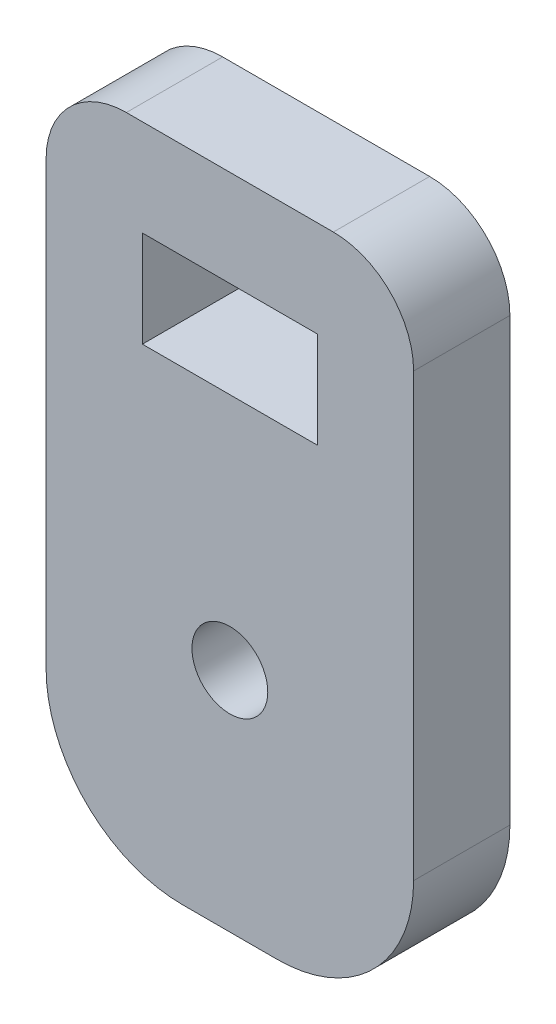
ISO-10303-21;
HEADER;
FILE_DESCRIPTION(('STEP AP214'),'2;1');
FILE_NAME('part.step','',(''),(''),'','','');
FILE_SCHEMA(('AUTOMOTIVE_DESIGN { 1 0 10303 214 1 1 1 1 }'));
ENDSEC;
DATA;
#1=APPLICATION_CONTEXT('core data for automotive mechanical design processes');
#2=APPLICATION_PROTOCOL_DEFINITION('international standard','automotive_design',2000,#1);
#3=PRODUCT_CONTEXT('',#1,'mechanical');
#4=PRODUCT('Part','Part','',(#3));
#5=PRODUCT_RELATED_PRODUCT_CATEGORY('part','',(#4));
#6=PRODUCT_DEFINITION_FORMATION('','',#4);
#7=PRODUCT_DEFINITION_CONTEXT('part definition',#1,'design');
#8=PRODUCT_DEFINITION('design','',#6,#7);
#9=PRODUCT_DEFINITION_SHAPE('','',#8);
#10=(LENGTH_UNIT() NAMED_UNIT(*) SI_UNIT(.MILLI.,.METRE.));
#11=(NAMED_UNIT(*) PLANE_ANGLE_UNIT() SI_UNIT($,.RADIAN.));
#12=(NAMED_UNIT(*) SI_UNIT($,.STERADIAN.) SOLID_ANGLE_UNIT());
#13=UNCERTAINTY_MEASURE_WITH_UNIT(LENGTH_MEASURE(1.E-05),#10,'distance_accuracy_value','');
#14=(GEOMETRIC_REPRESENTATION_CONTEXT(3) GLOBAL_UNCERTAINTY_ASSIGNED_CONTEXT((#13)) GLOBAL_UNIT_ASSIGNED_CONTEXT((#10,
#11,#12)) REPRESENTATION_CONTEXT('',''));
#15=CARTESIAN_POINT('',(0.,0.,0.));
#16=DIRECTION('',(0.,0.,1.));
#17=DIRECTION('',(1.,0.,0.));
#18=AXIS2_PLACEMENT_3D('',#15,#16,#17);
#19=CARTESIAN_POINT('',(0.,0.,15.24));
#20=DIRECTION('',(1.,0.,0.));
#21=DIRECTION('',(0.,0.,-1.));
#22=AXIS2_PLACEMENT_3D('',#19,#20,#21);
#23=PLANE('',#22);
#24=DIRECTION('',(0.,-1.,0.));
#25=VECTOR('',#24,1.);
#26=CARTESIAN_POINT('',(0.,0.,15.24));
#27=LINE('',#26,#25);
#28=CARTESIAN_POINT('',(0.,91.44,15.24));
#29=VERTEX_POINT('',#28);
#30=CARTESIAN_POINT('',(0.,21.59,15.24));
#31=VERTEX_POINT('',#30);
#32=EDGE_CURVE('E173',#29,#31,#27,.T.);
#33=ORIENTED_EDGE('',*,*,#32,.F.);
#34=DIRECTION('',(0.,0.,-1.));
#35=VECTOR('',#34,1.);
#36=CARTESIAN_POINT('',(0.,91.44,15.24));
#37=LINE('',#36,#35);
#38=CARTESIAN_POINT('',(0.,91.44,0.));
#39=VERTEX_POINT('',#38);
#40=EDGE_CURVE('E11',#29,#39,#37,.T.);
#41=ORIENTED_EDGE('',*,*,#40,.T.);
#42=DIRECTION('',(0.,-1.,0.));
#43=VECTOR('',#42,1.);
#44=CARTESIAN_POINT('',(0.,0.,0.));
#45=LINE('',#44,#43);
#46=CARTESIAN_POINT('',(0.,21.59,0.));
#47=VERTEX_POINT('',#46);
#48=EDGE_CURVE('E169',#39,#47,#45,.T.);
#49=ORIENTED_EDGE('',*,*,#48,.T.);
#50=DIRECTION('',(0.,0.,-1.));
#51=VECTOR('',#50,1.);
#52=CARTESIAN_POINT('',(0.,21.59,15.24));
#53=LINE('',#52,#51);
#54=EDGE_CURVE('E208',#47,#31,#53,.F.);
#55=ORIENTED_EDGE('',*,*,#54,.T.);
#56=EDGE_LOOP('',(#33,#41,#49,#55));
#57=FACE_BOUND('',#56,.T.);
#58=ADVANCED_FACE('F33',(#57),#23,.F.);
#59=CARTESIAN_POINT('',(0.,0.,15.24));
#60=DIRECTION('',(0.,1.,0.));
#61=DIRECTION('',(0.,0.,1.));
#62=AXIS2_PLACEMENT_3D('',#59,#60,#61);
#63=PLANE('',#62);
#64=DIRECTION('',(1.,0.,0.));
#65=VECTOR('',#64,1.);
#66=CARTESIAN_POINT('',(0.,0.,0.));
#67=LINE('',#66,#65);
#68=CARTESIAN_POINT('',(21.59,0.,0.));
#69=VERTEX_POINT('',#68);
#70=CARTESIAN_POINT('',(36.576,0.,0.));
#71=VERTEX_POINT('',#70);
#72=EDGE_CURVE('E185',#69,#71,#67,.T.);
#73=ORIENTED_EDGE('',*,*,#72,.T.);
#74=DIRECTION('',(0.,0.,-1.));
#75=VECTOR('',#74,1.);
#76=CARTESIAN_POINT('',(36.576,0.,15.24));
#77=LINE('',#76,#75);
#78=CARTESIAN_POINT('',(36.576,0.,15.24));
#79=VERTEX_POINT('',#78);
#80=EDGE_CURVE('E202',#71,#79,#77,.F.);
#81=ORIENTED_EDGE('',*,*,#80,.T.);
#82=DIRECTION('',(1.,0.,0.));
#83=VECTOR('',#82,1.);
#84=CARTESIAN_POINT('',(0.,0.,15.24));
#85=LINE('',#84,#83);
#86=CARTESIAN_POINT('',(21.59,0.,15.24));
#87=VERTEX_POINT('',#86);
#88=EDGE_CURVE('E175',#87,#79,#85,.T.);
#89=ORIENTED_EDGE('',*,*,#88,.F.);
#90=DIRECTION('',(0.,0.,-1.));
#91=VECTOR('',#90,1.);
#92=CARTESIAN_POINT('',(21.59,0.,15.24));
#93=LINE('',#92,#91);
#94=EDGE_CURVE('E199',#87,#69,#93,.T.);
#95=ORIENTED_EDGE('',*,*,#94,.T.);
#96=EDGE_LOOP('',(#73,#81,#89,#95));
#97=FACE_BOUND('',#96,.T.);
#98=ADVANCED_FACE('F240',(#97),#63,.F.);
#99=CARTESIAN_POINT('',(58.166,0.,15.24));
#100=DIRECTION('',(-1.,0.,0.));
#101=DIRECTION('',(0.,0.,1.));
#102=AXIS2_PLACEMENT_3D('',#99,#100,#101);
#103=PLANE('',#102);
#104=DIRECTION('',(0.,1.,0.));
#105=VECTOR('',#104,1.);
#106=CARTESIAN_POINT('',(58.166,0.,0.));
#107=LINE('',#106,#105);
#108=CARTESIAN_POINT('',(58.166,21.59,0.));
#109=VERTEX_POINT('',#108);
#110=CARTESIAN_POINT('',(58.166,91.44,0.));
#111=VERTEX_POINT('',#110);
#112=EDGE_CURVE('E188',#109,#111,#107,.T.);
#113=ORIENTED_EDGE('',*,*,#112,.T.);
#114=DIRECTION('',(0.,0.,-1.));
#115=VECTOR('',#114,1.);
#116=CARTESIAN_POINT('',(58.166,91.44,15.24));
#117=LINE('',#116,#115);
#118=CARTESIAN_POINT('',(58.166,91.44,15.24));
#119=VERTEX_POINT('',#118);
#120=EDGE_CURVE('E56',#111,#119,#117,.F.);
#121=ORIENTED_EDGE('',*,*,#120,.T.);
#122=DIRECTION('',(0.,1.,0.));
#123=VECTOR('',#122,1.);
#124=CARTESIAN_POINT('',(58.166,0.,15.24));
#125=LINE('',#124,#123);
#126=CARTESIAN_POINT('',(58.166,21.59,15.24));
#127=VERTEX_POINT('',#126);
#128=EDGE_CURVE('E179',#127,#119,#125,.T.);
#129=ORIENTED_EDGE('',*,*,#128,.F.);
#130=DIRECTION('',(0.,0.,-1.));
#131=VECTOR('',#130,1.);
#132=CARTESIAN_POINT('',(58.166,21.59,15.24));
#133=LINE('',#132,#131);
#134=EDGE_CURVE('E183',#127,#109,#133,.T.);
#135=ORIENTED_EDGE('',*,*,#134,.T.);
#136=EDGE_LOOP('',(#113,#121,#129,#135));
#137=FACE_BOUND('',#136,.T.);
#138=ADVANCED_FACE('F232',(#137),#103,.F.);
#139=CARTESIAN_POINT('',(0.,104.14,15.24));
#140=DIRECTION('',(0.,-1.,0.));
#141=DIRECTION('',(0.,0.,-1.));
#142=AXIS2_PLACEMENT_3D('',#139,#140,#141);
#143=PLANE('',#142);
#144=DIRECTION('',(-1.,0.,0.));
#145=VECTOR('',#144,1.);
#146=CARTESIAN_POINT('',(0.,104.14,15.24));
#147=LINE('',#146,#145);
#148=CARTESIAN_POINT('',(45.466,104.14,15.24));
#149=VERTEX_POINT('',#148);
#150=CARTESIAN_POINT('',(12.7,104.14,15.24));
#151=VERTEX_POINT('',#150);
#152=EDGE_CURVE('E181',#149,#151,#147,.T.);
#153=ORIENTED_EDGE('',*,*,#152,.F.);
#154=DIRECTION('',(0.,0.,-1.));
#155=VECTOR('',#154,1.);
#156=CARTESIAN_POINT('',(45.466,104.14,15.24));
#157=LINE('',#156,#155);
#158=CARTESIAN_POINT('',(45.466,104.14,0.));
#159=VERTEX_POINT('',#158);
#160=EDGE_CURVE('E213',#149,#159,#157,.T.);
#161=ORIENTED_EDGE('',*,*,#160,.T.);
#162=DIRECTION('',(-1.,0.,0.));
#163=VECTOR('',#162,1.);
#164=CARTESIAN_POINT('',(0.,104.14,0.));
#165=LINE('',#164,#163);
#166=CARTESIAN_POINT('',(12.7,104.14,0.));
#167=VERTEX_POINT('',#166);
#168=EDGE_CURVE('E176',#159,#167,#165,.T.);
#169=ORIENTED_EDGE('',*,*,#168,.T.);
#170=DIRECTION('',(0.,0.,-1.));
#171=VECTOR('',#170,1.);
#172=CARTESIAN_POINT('',(12.7,104.14,15.24));
#173=LINE('',#172,#171);
#174=EDGE_CURVE('E211',#167,#151,#173,.F.);
#175=ORIENTED_EDGE('',*,*,#174,.T.);
#176=EDGE_LOOP('',(#153,#161,#169,#175));
#177=FACE_BOUND('',#176,.T.);
#178=ADVANCED_FACE('F227',(#177),#143,.F.);
#179=CARTESIAN_POINT('',(0.,0.,15.24));
#180=DIRECTION('',(0.,0.,-1.));
#181=DIRECTION('',(-1.,0.,0.));
#182=AXIS2_PLACEMENT_3D('',#179,#180,#181);
#183=PLANE('',#182);
#184=CARTESIAN_POINT('',(29.083,35.9,15.24));
#185=DIRECTION('',(0.,0.,1.));
#186=DIRECTION('',(1.,0.,0.));
#187=AXIS2_PLACEMENT_3D('',#184,#185,#186);
#188=CIRCLE('',#187,6.);
#189=CARTESIAN_POINT('',(35.083,35.9,15.24));
#190=VERTEX_POINT('',#189);
#191=EDGE_CURVE('E156',#190,#190,#188,.T.);
#192=ORIENTED_EDGE('',*,*,#191,.F.);
#193=EDGE_LOOP('',(#192));
#194=FACE_BOUND('',#193,.T.);
#195=DIRECTION('',(1.,0.,0.));
#196=VECTOR('',#195,1.);
#197=CARTESIAN_POINT('',(15.24,73.66,15.24));
#198=LINE('',#197,#196);
#199=CARTESIAN_POINT('',(15.24,73.66,15.24));
#200=VERTEX_POINT('',#199);
#201=CARTESIAN_POINT('',(42.926,73.66,15.24));
#202=VERTEX_POINT('',#201);
#203=EDGE_CURVE('E162',#200,#202,#198,.T.);
#204=ORIENTED_EDGE('',*,*,#203,.F.);
#205=DIRECTION('',(0.,-1.,0.));
#206=VECTOR('',#205,1.);
#207=CARTESIAN_POINT('',(15.24,88.9,15.24));
#208=LINE('',#207,#206);
#209=CARTESIAN_POINT('',(15.24,88.9,15.24));
#210=VERTEX_POINT('',#209);
#211=EDGE_CURVE('E132',#210,#200,#208,.T.);
#212=ORIENTED_EDGE('',*,*,#211,.F.);
#213=DIRECTION('',(-1.,0.,0.));
#214=VECTOR('',#213,1.);
#215=CARTESIAN_POINT('',(15.24,88.9,15.24));
#216=LINE('',#215,#214);
#217=CARTESIAN_POINT('',(42.926,88.9,15.24));
#218=VERTEX_POINT('',#217);
#219=EDGE_CURVE('E150',#218,#210,#216,.T.);
#220=ORIENTED_EDGE('',*,*,#219,.F.);
#221=DIRECTION('',(0.,1.,0.));
#222=VECTOR('',#221,1.);
#223=CARTESIAN_POINT('',(42.926,88.9,15.24));
#224=LINE('',#223,#222);
#225=EDGE_CURVE('E153',#202,#218,#224,.T.);
#226=ORIENTED_EDGE('',*,*,#225,.F.);
#227=EDGE_LOOP('',(#204,#212,#220,#226));
#228=FACE_BOUND('',#227,.T.);
#229=ORIENTED_EDGE('',*,*,#128,.T.);
#230=CARTESIAN_POINT('',(45.466,91.44,15.24));
#231=DIRECTION('',(0.,0.,-1.));
#232=DIRECTION('',(-1.,0.,0.));
#233=AXIS2_PLACEMENT_3D('',#230,#231,#232);
#234=CIRCLE('',#233,12.7);
#235=EDGE_CURVE('E41',#119,#149,#234,.F.);
#236=ORIENTED_EDGE('',*,*,#235,.T.);
#237=ORIENTED_EDGE('',*,*,#152,.T.);
#238=CARTESIAN_POINT('',(12.7,91.44,15.24));
#239=DIRECTION('',(0.,0.,-1.));
#240=DIRECTION('',(-1.,0.,0.));
#241=AXIS2_PLACEMENT_3D('',#238,#239,#240);
#242=CIRCLE('',#241,12.7);
#243=EDGE_CURVE('E48',#151,#29,#242,.F.);
#244=ORIENTED_EDGE('',*,*,#243,.T.);
#245=ORIENTED_EDGE('',*,*,#32,.T.);
#246=CARTESIAN_POINT('',(21.59,21.59,15.24));
#247=DIRECTION('',(0.,0.,-1.));
#248=DIRECTION('',(-1.,0.,0.));
#249=AXIS2_PLACEMENT_3D('',#246,#247,#248);
#250=CIRCLE('',#249,21.59);
#251=EDGE_CURVE('E204',#31,#87,#250,.F.);
#252=ORIENTED_EDGE('',*,*,#251,.T.);
#253=ORIENTED_EDGE('',*,*,#88,.T.);
#254=CARTESIAN_POINT('',(36.576,21.59,15.24));
#255=DIRECTION('',(0.,0.,-1.));
#256=DIRECTION('',(-1.,0.,0.));
#257=AXIS2_PLACEMENT_3D('',#254,#255,#256);
#258=CIRCLE('',#257,21.59);
#259=EDGE_CURVE('E206',#79,#127,#258,.F.);
#260=ORIENTED_EDGE('',*,*,#259,.T.);
#261=EDGE_LOOP('',(#229,#236,#237,#244,#245,#252,#253,#260));
#262=FACE_BOUND('',#261,.T.);
#263=ADVANCED_FACE('F223',(#194,#228,#262),#183,.F.);
#264=CARTESIAN_POINT('',(0.,0.,0.));
#265=DIRECTION('',(0.,0.,-1.));
#266=DIRECTION('',(-1.,0.,0.));
#267=AXIS2_PLACEMENT_3D('',#264,#265,#266);
#268=PLANE('',#267);
#269=CARTESIAN_POINT('',(29.083,35.9,0.));
#270=DIRECTION('',(0.,0.,1.));
#271=DIRECTION('',(1.,0.,0.));
#272=AXIS2_PLACEMENT_3D('',#269,#270,#271);
#273=CIRCLE('',#272,6.);
#274=CARTESIAN_POINT('',(35.083,35.9,0.));
#275=VERTEX_POINT('',#274);
#276=EDGE_CURVE('E163',#275,#275,#273,.T.);
#277=ORIENTED_EDGE('',*,*,#276,.T.);
#278=EDGE_LOOP('',(#277));
#279=FACE_BOUND('',#278,.T.);
#280=DIRECTION('',(0.,-1.,0.));
#281=VECTOR('',#280,1.);
#282=CARTESIAN_POINT('',(15.24,88.9,0.));
#283=LINE('',#282,#281);
#284=CARTESIAN_POINT('',(15.24,88.9,0.));
#285=VERTEX_POINT('',#284);
#286=CARTESIAN_POINT('',(15.24,73.66,0.));
#287=VERTEX_POINT('',#286);
#288=EDGE_CURVE('E129',#285,#287,#283,.T.);
#289=ORIENTED_EDGE('',*,*,#288,.T.);
#290=DIRECTION('',(1.,0.,0.));
#291=VECTOR('',#290,1.);
#292=CARTESIAN_POINT('',(15.24,73.66,0.));
#293=LINE('',#292,#291);
#294=CARTESIAN_POINT('',(42.926,73.66,0.));
#295=VERTEX_POINT('',#294);
#296=EDGE_CURVE('E141',#287,#295,#293,.T.);
#297=ORIENTED_EDGE('',*,*,#296,.T.);
#298=DIRECTION('',(0.,1.,0.));
#299=VECTOR('',#298,1.);
#300=CARTESIAN_POINT('',(42.926,88.9,0.));
#301=LINE('',#300,#299);
#302=CARTESIAN_POINT('',(42.926,88.9,0.));
#303=VERTEX_POINT('',#302);
#304=EDGE_CURVE('E145',#295,#303,#301,.T.);
#305=ORIENTED_EDGE('',*,*,#304,.T.);
#306=DIRECTION('',(-1.,0.,0.));
#307=VECTOR('',#306,1.);
#308=CARTESIAN_POINT('',(15.24,88.9,0.));
#309=LINE('',#308,#307);
#310=EDGE_CURVE('E137',#303,#285,#309,.T.);
#311=ORIENTED_EDGE('',*,*,#310,.T.);
#312=EDGE_LOOP('',(#289,#297,#305,#311));
#313=FACE_BOUND('',#312,.T.);
#314=ORIENTED_EDGE('',*,*,#168,.F.);
#315=CARTESIAN_POINT('',(45.466,91.44,0.));
#316=DIRECTION('',(0.,0.,-1.));
#317=DIRECTION('',(-1.,0.,0.));
#318=AXIS2_PLACEMENT_3D('',#315,#316,#317);
#319=CIRCLE('',#318,12.7);
#320=EDGE_CURVE('E218',#159,#111,#319,.T.);
#321=ORIENTED_EDGE('',*,*,#320,.T.);
#322=ORIENTED_EDGE('',*,*,#112,.F.);
#323=CARTESIAN_POINT('',(36.576,21.59,0.));
#324=DIRECTION('',(0.,0.,-1.));
#325=DIRECTION('',(-1.,0.,0.));
#326=AXIS2_PLACEMENT_3D('',#323,#324,#325);
#327=CIRCLE('',#326,21.59);
#328=EDGE_CURVE('E197',#109,#71,#327,.T.);
#329=ORIENTED_EDGE('',*,*,#328,.T.);
#330=ORIENTED_EDGE('',*,*,#72,.F.);
#331=CARTESIAN_POINT('',(21.59,21.59,0.));
#332=DIRECTION('',(0.,0.,-1.));
#333=DIRECTION('',(-1.,0.,0.));
#334=AXIS2_PLACEMENT_3D('',#331,#332,#333);
#335=CIRCLE('',#334,21.59);
#336=EDGE_CURVE('E194',#69,#47,#335,.T.);
#337=ORIENTED_EDGE('',*,*,#336,.T.);
#338=ORIENTED_EDGE('',*,*,#48,.F.);
#339=CARTESIAN_POINT('',(12.7,91.44,0.));
#340=DIRECTION('',(0.,0.,-1.));
#341=DIRECTION('',(-1.,0.,0.));
#342=AXIS2_PLACEMENT_3D('',#339,#340,#341);
#343=CIRCLE('',#342,12.7);
#344=EDGE_CURVE('E216',#39,#167,#343,.T.);
#345=ORIENTED_EDGE('',*,*,#344,.T.);
#346=EDGE_LOOP('',(#314,#321,#322,#329,#330,#337,#338,#345));
#347=FACE_BOUND('',#346,.T.);
#348=ADVANCED_FACE('F147',(#279,#313,#347),#268,.T.);
#349=CARTESIAN_POINT('',(15.24,88.9,0.));
#350=DIRECTION('',(-1.,0.,0.));
#351=DIRECTION('',(0.,-1.,0.));
#352=AXIS2_PLACEMENT_3D('',#349,#350,#351);
#353=PLANE('',#352);
#354=ORIENTED_EDGE('',*,*,#211,.T.);
#355=DIRECTION('',(0.,0.,1.));
#356=VECTOR('',#355,1.);
#357=CARTESIAN_POINT('',(15.24,73.66,0.));
#358=LINE('',#357,#356);
#359=EDGE_CURVE('E125',#287,#200,#358,.T.);
#360=ORIENTED_EDGE('',*,*,#359,.F.);
#361=ORIENTED_EDGE('',*,*,#288,.F.);
#362=DIRECTION('',(0.,0.,1.));
#363=VECTOR('',#362,1.);
#364=CARTESIAN_POINT('',(15.24,88.9,0.));
#365=LINE('',#364,#363);
#366=EDGE_CURVE('E167',#285,#210,#365,.T.);
#367=ORIENTED_EDGE('',*,*,#366,.T.);
#368=EDGE_LOOP('',(#354,#360,#361,#367));
#369=FACE_BOUND('',#368,.T.);
#370=ADVANCED_FACE('F127',(#369),#353,.F.);
#371=CARTESIAN_POINT('',(15.24,88.9,0.));
#372=DIRECTION('',(0.,1.,0.));
#373=DIRECTION('',(-1.,0.,0.));
#374=AXIS2_PLACEMENT_3D('',#371,#372,#373);
#375=PLANE('',#374);
#376=ORIENTED_EDGE('',*,*,#219,.T.);
#377=ORIENTED_EDGE('',*,*,#366,.F.);
#378=ORIENTED_EDGE('',*,*,#310,.F.);
#379=DIRECTION('',(0.,0.,1.));
#380=VECTOR('',#379,1.);
#381=CARTESIAN_POINT('',(42.926,88.9,0.));
#382=LINE('',#381,#380);
#383=EDGE_CURVE('E170',#303,#218,#382,.T.);
#384=ORIENTED_EDGE('',*,*,#383,.T.);
#385=EDGE_LOOP('',(#376,#377,#378,#384));
#386=FACE_BOUND('',#385,.T.);
#387=ADVANCED_FACE('F356',(#386),#375,.F.);
#388=CARTESIAN_POINT('',(42.926,88.9,0.));
#389=DIRECTION('',(1.,0.,0.));
#390=DIRECTION('',(0.,0.,-1.));
#391=AXIS2_PLACEMENT_3D('',#388,#389,#390);
#392=PLANE('',#391);
#393=ORIENTED_EDGE('',*,*,#225,.T.);
#394=ORIENTED_EDGE('',*,*,#383,.F.);
#395=ORIENTED_EDGE('',*,*,#304,.F.);
#396=DIRECTION('',(0.,0.,1.));
#397=VECTOR('',#396,1.);
#398=CARTESIAN_POINT('',(42.926,73.66,0.));
#399=LINE('',#398,#397);
#400=EDGE_CURVE('E136',#295,#202,#399,.T.);
#401=ORIENTED_EDGE('',*,*,#400,.T.);
#402=EDGE_LOOP('',(#393,#394,#395,#401));
#403=FACE_BOUND('',#402,.T.);
#404=ADVANCED_FACE('F348',(#403),#392,.F.);
#405=CARTESIAN_POINT('',(15.24,73.66,0.));
#406=DIRECTION('',(0.,-1.,0.));
#407=DIRECTION('',(1.,0.,0.));
#408=AXIS2_PLACEMENT_3D('',#405,#406,#407);
#409=PLANE('',#408);
#410=ORIENTED_EDGE('',*,*,#203,.T.);
#411=ORIENTED_EDGE('',*,*,#400,.F.);
#412=ORIENTED_EDGE('',*,*,#296,.F.);
#413=ORIENTED_EDGE('',*,*,#359,.T.);
#414=EDGE_LOOP('',(#410,#411,#412,#413));
#415=FACE_BOUND('',#414,.T.);
#416=ADVANCED_FACE('F142',(#415),#409,.F.);
#417=CARTESIAN_POINT('',(29.083,35.9,0.));
#418=DIRECTION('',(0.,0.,1.));
#419=DIRECTION('',(1.,0.,0.));
#420=AXIS2_PLACEMENT_3D('',#417,#418,#419);
#421=CYLINDRICAL_SURFACE('',#420,6.);
#422=CARTESIAN_POINT('',(35.083,35.9,0.));
#423=CARTESIAN_POINT('',(35.083,35.9,0.15875));
#424=CARTESIAN_POINT('',(35.083,35.9,0.3175));
#425=CARTESIAN_POINT('',(35.083,35.9,0.635));
#426=CARTESIAN_POINT('',(35.083,35.9,0.79375));
#427=CARTESIAN_POINT('',(35.083,35.9,1.11125));
#428=CARTESIAN_POINT('',(35.083,35.9,1.27));
#429=CARTESIAN_POINT('',(35.083,35.9,1.5875));
#430=CARTESIAN_POINT('',(35.083,35.9,1.74625));
#431=CARTESIAN_POINT('',(35.083,35.9,2.06375));
#432=CARTESIAN_POINT('',(35.083,35.9,2.2225));
#433=CARTESIAN_POINT('',(35.083,35.9,2.54));
#434=CARTESIAN_POINT('',(35.083,35.9,2.69875));
#435=CARTESIAN_POINT('',(35.083,35.9,3.01625));
#436=CARTESIAN_POINT('',(35.083,35.9,3.175));
#437=CARTESIAN_POINT('',(35.083,35.9,3.4925));
#438=CARTESIAN_POINT('',(35.083,35.9,3.65125));
#439=CARTESIAN_POINT('',(35.083,35.9,3.96875));
#440=CARTESIAN_POINT('',(35.083,35.9,4.1275));
#441=CARTESIAN_POINT('',(35.083,35.9,4.445));
#442=CARTESIAN_POINT('',(35.083,35.9,4.60375));
#443=CARTESIAN_POINT('',(35.083,35.9,4.92125));
#444=CARTESIAN_POINT('',(35.083,35.9,5.08));
#445=CARTESIAN_POINT('',(35.083,35.9,5.3975));
#446=CARTESIAN_POINT('',(35.083,35.9,5.55625));
#447=CARTESIAN_POINT('',(35.083,35.9,5.87375));
#448=CARTESIAN_POINT('',(35.083,35.9,6.0325));
#449=CARTESIAN_POINT('',(35.083,35.9,6.35));
#450=CARTESIAN_POINT('',(35.083,35.9,6.50875));
#451=CARTESIAN_POINT('',(35.083,35.9,6.82625));
#452=CARTESIAN_POINT('',(35.083,35.9,6.985));
#453=CARTESIAN_POINT('',(35.083,35.9,7.3025));
#454=CARTESIAN_POINT('',(35.083,35.9,7.46125));
#455=CARTESIAN_POINT('',(35.083,35.9,7.77875));
#456=CARTESIAN_POINT('',(35.083,35.9,7.9375));
#457=CARTESIAN_POINT('',(35.083,35.9,8.255));
#458=CARTESIAN_POINT('',(35.083,35.9,8.41375));
#459=CARTESIAN_POINT('',(35.083,35.9,8.73125));
#460=CARTESIAN_POINT('',(35.083,35.9,8.89));
#461=CARTESIAN_POINT('',(35.083,35.9,9.2075));
#462=CARTESIAN_POINT('',(35.083,35.9,9.36625));
#463=CARTESIAN_POINT('',(35.083,35.9,9.68375));
#464=CARTESIAN_POINT('',(35.083,35.9,9.8425));
#465=CARTESIAN_POINT('',(35.083,35.9,10.16));
#466=CARTESIAN_POINT('',(35.083,35.9,10.31875));
#467=CARTESIAN_POINT('',(35.083,35.9,10.63625));
#468=CARTESIAN_POINT('',(35.083,35.9,10.795));
#469=CARTESIAN_POINT('',(35.083,35.9,11.1125));
#470=CARTESIAN_POINT('',(35.083,35.9,11.27125));
#471=CARTESIAN_POINT('',(35.083,35.9,11.58875));
#472=CARTESIAN_POINT('',(35.083,35.9,11.7475));
#473=CARTESIAN_POINT('',(35.083,35.9,12.065));
#474=CARTESIAN_POINT('',(35.083,35.9,12.22375));
#475=CARTESIAN_POINT('',(35.083,35.9,12.54125));
#476=CARTESIAN_POINT('',(35.083,35.9,12.7));
#477=CARTESIAN_POINT('',(35.083,35.9,13.0175));
#478=CARTESIAN_POINT('',(35.083,35.9,13.17625));
#479=CARTESIAN_POINT('',(35.083,35.9,13.49375));
#480=CARTESIAN_POINT('',(35.083,35.9,13.6525));
#481=CARTESIAN_POINT('',(35.083,35.9,13.97));
#482=CARTESIAN_POINT('',(35.083,35.9,14.12875));
#483=CARTESIAN_POINT('',(35.083,35.9,14.44625));
#484=CARTESIAN_POINT('',(35.083,35.9,14.605));
#485=CARTESIAN_POINT('',(35.083,35.9,14.9225));
#486=CARTESIAN_POINT('',(35.083,35.9,15.08125));
#487=CARTESIAN_POINT('',(35.083,35.9,15.24));
#488=B_SPLINE_CURVE_WITH_KNOTS('',3,(#422,#423,#424,#425,#426,#427,#428,#429,#430,#431,#432,
#433,#434,#435,#436,#437,#438,#439,#440,#441,#442,#443,#444,#445,#446,#447,#448,#449,#450,#451,
#452,#453,#454,#455,#456,#457,#458,#459,#460,#461,#462,#463,#464,#465,#466,#467,#468,#469,#470,
#471,#472,#473,#474,#475,#476,#477,#478,#479,#480,#481,#482,#483,#484,#485,#486,#487),
.UNSPECIFIED.,.F.,.F.,(4,2,2,2,2,2,2,2,2,2,2,2,2,2,2,2,2,2,2,2,2,2,2,2,2,2,2,2,2,2,2,2,4),(0.,
0.47625,0.9525,1.42875,1.905,2.38125,2.8575,3.33375,3.81,4.28625,4.7625,5.23875,5.715,6.19125,
6.6675,7.14375,7.62,8.09625,8.5725,9.04875,9.525,10.00125,10.4775,10.95375,11.43,11.90625,
12.3825,12.85875,13.335,13.81125,14.2875,14.76375,15.24),.UNSPECIFIED.);
#489=EDGE_CURVE('BSEAM265',#275,#190,#488,.T.);
#490=ORIENTED_EDGE('',*,*,#276,.F.);
#491=ORIENTED_EDGE('',*,*,#191,.T.);
#492=ORIENTED_EDGE('',*,*,#489,.T.);
#493=ORIENTED_EDGE('',*,*,#489,.F.);
#494=EDGE_LOOP('',(#490,#492,#491,#493));
#495=FACE_BOUND('',#494,.T.);
#496=ADVANCED_FACE('F265',(#495),#421,.F.);
#497=CARTESIAN_POINT('',(36.576,21.59,15.24));
#498=DIRECTION('',(0.,0.,-1.));
#499=DIRECTION('',(-1.,0.,0.));
#500=AXIS2_PLACEMENT_3D('',#497,#498,#499);
#501=CYLINDRICAL_SURFACE('',#500,21.59);
#502=ORIENTED_EDGE('',*,*,#259,.F.);
#503=ORIENTED_EDGE('',*,*,#80,.F.);
#504=ORIENTED_EDGE('',*,*,#328,.F.);
#505=ORIENTED_EDGE('',*,*,#134,.F.);
#506=EDGE_LOOP('',(#502,#503,#504,#505));
#507=FACE_BOUND('',#506,.T.);
#508=ADVANCED_FACE('F236',(#507),#501,.T.);
#509=CARTESIAN_POINT('',(21.59,21.59,15.24));
#510=DIRECTION('',(0.,0.,-1.));
#511=DIRECTION('',(-1.,0.,0.));
#512=AXIS2_PLACEMENT_3D('',#509,#510,#511);
#513=CYLINDRICAL_SURFACE('',#512,21.59);
#514=ORIENTED_EDGE('',*,*,#251,.F.);
#515=ORIENTED_EDGE('',*,*,#54,.F.);
#516=ORIENTED_EDGE('',*,*,#336,.F.);
#517=ORIENTED_EDGE('',*,*,#94,.F.);
#518=EDGE_LOOP('',(#514,#515,#516,#517));
#519=FACE_BOUND('',#518,.T.);
#520=ADVANCED_FACE('F245',(#519),#513,.T.);
#521=CARTESIAN_POINT('',(45.466,91.44,15.24));
#522=DIRECTION('',(0.,0.,-1.));
#523=DIRECTION('',(-1.,0.,0.));
#524=AXIS2_PLACEMENT_3D('',#521,#522,#523);
#525=CYLINDRICAL_SURFACE('',#524,12.7);
#526=ORIENTED_EDGE('',*,*,#235,.F.);
#527=ORIENTED_EDGE('',*,*,#120,.F.);
#528=ORIENTED_EDGE('',*,*,#320,.F.);
#529=ORIENTED_EDGE('',*,*,#160,.F.);
#530=EDGE_LOOP('',(#526,#527,#528,#529));
#531=FACE_BOUND('',#530,.T.);
#532=ADVANCED_FACE('F230',(#531),#525,.T.);
#533=CARTESIAN_POINT('',(12.7,91.44,15.24));
#534=DIRECTION('',(0.,0.,-1.));
#535=DIRECTION('',(-1.,0.,0.));
#536=AXIS2_PLACEMENT_3D('',#533,#534,#535);
#537=CYLINDRICAL_SURFACE('',#536,12.7);
#538=ORIENTED_EDGE('',*,*,#243,.F.);
#539=ORIENTED_EDGE('',*,*,#174,.F.);
#540=ORIENTED_EDGE('',*,*,#344,.F.);
#541=ORIENTED_EDGE('',*,*,#40,.F.);
#542=EDGE_LOOP('',(#538,#539,#540,#541));
#543=FACE_BOUND('',#542,.T.);
#544=ADVANCED_FACE('F35',(#543),#537,.T.);
#545=CLOSED_SHELL('',(#58,#98,#138,#178,#263,#348,#370,#387,#404,#416,#496,#508,#520,#532,#544));
#546=MANIFOLD_SOLID_BREP('B2',#545);
#547=ADVANCED_BREP_SHAPE_REPRESENTATION('',(#18,#546),#14);
#548=SHAPE_DEFINITION_REPRESENTATION(#9,#547);
ENDSEC;
END-ISO-10303-21;
